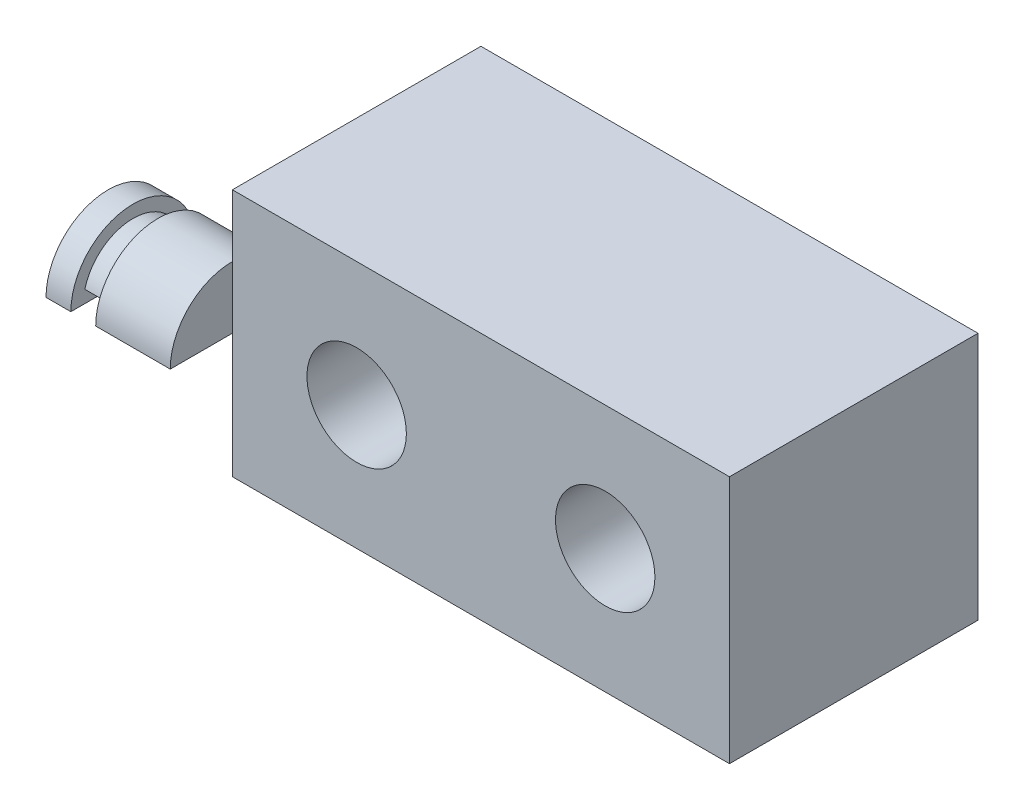
ISO-10303-21;
HEADER;
FILE_DESCRIPTION(('STEP AP214'),'2;1');
FILE_NAME('part.step','',(''),(''),'','','');
FILE_SCHEMA(('AUTOMOTIVE_DESIGN { 1 0 10303 214 1 1 1 1 }'));
ENDSEC;
DATA;
#1=APPLICATION_CONTEXT('core data for automotive mechanical design processes');
#2=APPLICATION_PROTOCOL_DEFINITION('international standard','automotive_design',2000,#1);
#3=PRODUCT_CONTEXT('',#1,'mechanical');
#4=PRODUCT('Part','Part','',(#3));
#5=PRODUCT_RELATED_PRODUCT_CATEGORY('part','',(#4));
#6=PRODUCT_DEFINITION_FORMATION('','',#4);
#7=PRODUCT_DEFINITION_CONTEXT('part definition',#1,'design');
#8=PRODUCT_DEFINITION('design','',#6,#7);
#9=PRODUCT_DEFINITION_SHAPE('','',#8);
#10=(LENGTH_UNIT() NAMED_UNIT(*) SI_UNIT(.MILLI.,.METRE.));
#11=(NAMED_UNIT(*) PLANE_ANGLE_UNIT() SI_UNIT($,.RADIAN.));
#12=(NAMED_UNIT(*) SI_UNIT($,.STERADIAN.) SOLID_ANGLE_UNIT());
#13=UNCERTAINTY_MEASURE_WITH_UNIT(LENGTH_MEASURE(1.E-05),#10,'distance_accuracy_value','');
#14=(GEOMETRIC_REPRESENTATION_CONTEXT(3) GLOBAL_UNCERTAINTY_ASSIGNED_CONTEXT((#13)) GLOBAL_UNIT_ASSIGNED_CONTEXT((#10,
#11,#12)) REPRESENTATION_CONTEXT('',''));
#15=CARTESIAN_POINT('',(0.,0.,0.));
#16=DIRECTION('',(0.,0.,1.));
#17=DIRECTION('',(1.,0.,0.));
#18=AXIS2_PLACEMENT_3D('',#15,#16,#17);
#19=CARTESIAN_POINT('',(-12.7,-12.7,0.));
#20=DIRECTION('',(1.,0.,0.));
#21=DIRECTION('',(0.,0.,-1.));
#22=AXIS2_PLACEMENT_3D('',#19,#20,#21);
#23=CYLINDRICAL_SURFACE('',#22,6.35);
#24=CARTESIAN_POINT('',(-7.62,-12.7,0.));
#25=DIRECTION('',(1.,0.,0.));
#26=DIRECTION('',(0.,0.,1.));
#27=AXIS2_PLACEMENT_3D('',#24,#25,#26);
#28=CIRCLE('',#27,6.35);
#29=CARTESIAN_POINT('',(-7.62,-12.7,-6.35));
#30=VERTEX_POINT('',#29);
#31=CARTESIAN_POINT('',(-7.62,-12.7,6.35));
#32=VERTEX_POINT('',#31);
#33=EDGE_CURVE('E57',#30,#32,#28,.T.);
#34=ORIENTED_EDGE('',*,*,#33,.T.);
#35=DIRECTION('',(1.,0.,0.));
#36=VECTOR('',#35,1.);
#37=CARTESIAN_POINT('',(-12.7,-12.7,6.35));
#38=LINE('',#37,#36);
#39=CARTESIAN_POINT('',(0.,-12.7,6.35));
#40=VERTEX_POINT('',#39);
#41=EDGE_CURVE('E173',#32,#40,#38,.T.);
#42=ORIENTED_EDGE('',*,*,#41,.T.);
#43=CARTESIAN_POINT('',(0.,-12.7,0.));
#44=DIRECTION('',(-1.,0.,0.));
#45=DIRECTION('',(0.,0.,1.));
#46=AXIS2_PLACEMENT_3D('',#43,#44,#45);
#47=CIRCLE('',#46,6.35);
#48=CARTESIAN_POINT('',(0.,-6.35,0.));
#49=VERTEX_POINT('',#48);
#50=EDGE_CURVE('E51',#40,#49,#47,.T.);
#51=ORIENTED_EDGE('',*,*,#50,.T.);
#52=CARTESIAN_POINT('',(0.,-12.7,-6.35));
#53=VERTEX_POINT('',#52);
#54=EDGE_CURVE('E11',#49,#53,#47,.T.);
#55=ORIENTED_EDGE('',*,*,#54,.T.);
#56=DIRECTION('',(1.,0.,0.));
#57=VECTOR('',#56,1.);
#58=CARTESIAN_POINT('',(-12.7,-12.7,-6.35));
#59=LINE('',#58,#57);
#60=EDGE_CURVE('E184',#30,#53,#59,.T.);
#61=ORIENTED_EDGE('',*,*,#60,.F.);
#62=EDGE_LOOP('',(#34,#42,#51,#55,#61));
#63=FACE_BOUND('',#62,.T.);
#64=ADVANCED_FACE('F39',(#63),#23,.T.);
#65=CARTESIAN_POINT('',(-12.7,-12.7,0.));
#66=DIRECTION('',(0.,-1.,0.));
#67=DIRECTION('',(0.,0.,-1.));
#68=AXIS2_PLACEMENT_3D('',#65,#66,#67);
#69=PLANE('',#68);
#70=ORIENTED_EDGE('',*,*,#41,.F.);
#71=DIRECTION('',(0.,0.,-1.));
#72=VECTOR('',#71,1.);
#73=CARTESIAN_POINT('',(-7.62,-12.7,6.35));
#74=LINE('',#73,#72);
#75=EDGE_CURVE('E159',#32,#30,#74,.T.);
#76=ORIENTED_EDGE('',*,*,#75,.T.);
#77=ORIENTED_EDGE('',*,*,#60,.T.);
#78=DIRECTION('',(0.,0.,-1.));
#79=VECTOR('',#78,1.);
#80=CARTESIAN_POINT('',(0.,-12.7,0.));
#81=LINE('',#80,#79);
#82=CARTESIAN_POINT('',(0.,-12.7,0.));
#83=VERTEX_POINT('',#82);
#84=EDGE_CURVE('E49',#83,#53,#81,.T.);
#85=ORIENTED_EDGE('',*,*,#84,.F.);
#86=EDGE_CURVE('E170',#40,#83,#81,.T.);
#87=ORIENTED_EDGE('',*,*,#86,.F.);
#88=EDGE_LOOP('',(#70,#76,#77,#85,#87));
#89=FACE_BOUND('',#88,.T.);
#90=ADVANCED_FACE('F281',(#89),#69,.T.);
#91=CARTESIAN_POINT('',(0.,-25.4,0.));
#92=DIRECTION('',(-1.,0.,0.));
#93=DIRECTION('',(0.,0.,1.));
#94=AXIS2_PLACEMENT_3D('',#91,#92,#93);
#95=PLANE('',#94);
#96=ORIENTED_EDGE('',*,*,#54,.F.);
#97=DIRECTION('',(0.,1.,0.));
#98=VECTOR('',#97,1.);
#99=CARTESIAN_POINT('',(0.,-25.4,0.));
#100=LINE('',#99,#98);
#101=CARTESIAN_POINT('',(0.,0.,0.));
#102=VERTEX_POINT('',#101);
#103=EDGE_CURVE('E223',#49,#102,#100,.T.);
#104=ORIENTED_EDGE('',*,*,#103,.T.);
#105=DIRECTION('',(0.,0.,1.));
#106=VECTOR('',#105,1.);
#107=CARTESIAN_POINT('',(0.,0.,0.));
#108=LINE('',#107,#106);
#109=CARTESIAN_POINT('',(0.,0.,-25.4));
#110=VERTEX_POINT('',#109);
#111=EDGE_CURVE('E194',#110,#102,#108,.T.);
#112=ORIENTED_EDGE('',*,*,#111,.F.);
#113=DIRECTION('',(0.,1.,0.));
#114=VECTOR('',#113,1.);
#115=CARTESIAN_POINT('',(0.,-25.4,-25.4));
#116=LINE('',#115,#114);
#117=CARTESIAN_POINT('',(0.,-25.4,-25.4));
#118=VERTEX_POINT('',#117);
#119=EDGE_CURVE('E238',#118,#110,#116,.T.);
#120=ORIENTED_EDGE('',*,*,#119,.F.);
#121=DIRECTION('',(0.,0.,1.));
#122=VECTOR('',#121,1.);
#123=CARTESIAN_POINT('',(0.,-25.4,0.));
#124=LINE('',#123,#122);
#125=CARTESIAN_POINT('',(0.,-25.4,0.));
#126=VERTEX_POINT('',#125);
#127=EDGE_CURVE('E206',#118,#126,#124,.T.);
#128=ORIENTED_EDGE('',*,*,#127,.T.);
#129=EDGE_CURVE('E43',#126,#83,#100,.T.);
#130=ORIENTED_EDGE('',*,*,#129,.T.);
#131=ORIENTED_EDGE('',*,*,#84,.T.);
#132=EDGE_LOOP('',(#96,#104,#112,#120,#128,#130,#131));
#133=FACE_BOUND('',#132,.T.);
#134=ADVANCED_FACE('F41',(#133),#95,.T.);
#135=CARTESIAN_POINT('',(0.,-25.4,-25.4));
#136=DIRECTION('',(0.,0.,-1.));
#137=DIRECTION('',(-1.,0.,0.));
#138=AXIS2_PLACEMENT_3D('',#135,#136,#137);
#139=PLANE('',#138);
#140=DIRECTION('',(-1.,0.,0.));
#141=VECTOR('',#140,1.);
#142=CARTESIAN_POINT('',(0.,0.,-25.4));
#143=LINE('',#142,#141);
#144=CARTESIAN_POINT('',(50.8,0.,-25.4));
#145=VERTEX_POINT('',#144);
#146=EDGE_CURVE('E211',#145,#110,#143,.T.);
#147=ORIENTED_EDGE('',*,*,#146,.F.);
#148=DIRECTION('',(0.,1.,0.));
#149=VECTOR('',#148,1.);
#150=CARTESIAN_POINT('',(50.8,-25.4,-25.4));
#151=LINE('',#150,#149);
#152=CARTESIAN_POINT('',(50.8,-25.4,-25.4));
#153=VERTEX_POINT('',#152);
#154=EDGE_CURVE('E241',#153,#145,#151,.T.);
#155=ORIENTED_EDGE('',*,*,#154,.F.);
#156=DIRECTION('',(-1.,0.,0.));
#157=VECTOR('',#156,1.);
#158=CARTESIAN_POINT('',(0.,-25.4,-25.4));
#159=LINE('',#158,#157);
#160=EDGE_CURVE('E219',#153,#118,#159,.T.);
#161=ORIENTED_EDGE('',*,*,#160,.T.);
#162=ORIENTED_EDGE('',*,*,#119,.T.);
#163=EDGE_LOOP('',(#147,#155,#161,#162));
#164=FACE_BOUND('',#163,.T.);
#165=ADVANCED_FACE('F264',(#164),#139,.T.);
#166=CARTESIAN_POINT('',(50.8,-25.4,0.));
#167=DIRECTION('',(1.,0.,0.));
#168=DIRECTION('',(0.,0.,-1.));
#169=AXIS2_PLACEMENT_3D('',#166,#167,#168);
#170=PLANE('',#169);
#171=DIRECTION('',(0.,0.,-1.));
#172=VECTOR('',#171,1.);
#173=CARTESIAN_POINT('',(50.8,0.,0.));
#174=LINE('',#173,#172);
#175=CARTESIAN_POINT('',(50.8,0.,0.));
#176=VERTEX_POINT('',#175);
#177=EDGE_CURVE('E231',#176,#145,#174,.T.);
#178=ORIENTED_EDGE('',*,*,#177,.F.);
#179=DIRECTION('',(0.,1.,0.));
#180=VECTOR('',#179,1.);
#181=CARTESIAN_POINT('',(50.8,-25.4,0.));
#182=LINE('',#181,#180);
#183=CARTESIAN_POINT('',(50.8,-25.4,0.));
#184=VERTEX_POINT('',#183);
#185=EDGE_CURVE('E243',#184,#176,#182,.T.);
#186=ORIENTED_EDGE('',*,*,#185,.F.);
#187=DIRECTION('',(0.,0.,-1.));
#188=VECTOR('',#187,1.);
#189=CARTESIAN_POINT('',(50.8,-25.4,0.));
#190=LINE('',#189,#188);
#191=EDGE_CURVE('E215',#184,#153,#190,.T.);
#192=ORIENTED_EDGE('',*,*,#191,.T.);
#193=ORIENTED_EDGE('',*,*,#154,.T.);
#194=EDGE_LOOP('',(#178,#186,#192,#193));
#195=FACE_BOUND('',#194,.T.);
#196=ADVANCED_FACE('F346',(#195),#170,.T.);
#197=CARTESIAN_POINT('',(0.,-25.4,0.));
#198=DIRECTION('',(0.,0.,1.));
#199=DIRECTION('',(1.,0.,0.));
#200=AXIS2_PLACEMENT_3D('',#197,#198,#199);
#201=PLANE('',#200);
#202=CARTESIAN_POINT('',(12.7,-12.7,0.));
#203=DIRECTION('',(0.,0.,1.));
#204=DIRECTION('',(1.,0.,0.));
#205=AXIS2_PLACEMENT_3D('',#202,#203,#204);
#206=CIRCLE('',#205,5.08);
#207=CARTESIAN_POINT('',(17.78,-12.7,0.));
#208=VERTEX_POINT('',#207);
#209=EDGE_CURVE('E195',#208,#208,#206,.T.);
#210=ORIENTED_EDGE('',*,*,#209,.F.);
#211=EDGE_LOOP('',(#210));
#212=FACE_BOUND('',#211,.T.);
#213=CARTESIAN_POINT('',(38.1,-12.7,0.));
#214=DIRECTION('',(0.,0.,1.));
#215=DIRECTION('',(1.,0.,0.));
#216=AXIS2_PLACEMENT_3D('',#213,#214,#215);
#217=CIRCLE('',#216,5.08000000000001);
#218=CARTESIAN_POINT('',(43.18,-12.7,0.));
#219=VERTEX_POINT('',#218);
#220=EDGE_CURVE('E189',#219,#219,#217,.T.);
#221=ORIENTED_EDGE('',*,*,#220,.F.);
#222=EDGE_LOOP('',(#221));
#223=FACE_BOUND('',#222,.T.);
#224=DIRECTION('',(1.,0.,0.));
#225=VECTOR('',#224,1.);
#226=CARTESIAN_POINT('',(0.,0.,0.));
#227=LINE('',#226,#225);
#228=EDGE_CURVE('E227',#102,#176,#227,.T.);
#229=ORIENTED_EDGE('',*,*,#228,.F.);
#230=ORIENTED_EDGE('',*,*,#103,.F.);
#231=EDGE_CURVE('E250',#83,#49,#100,.T.);
#232=ORIENTED_EDGE('',*,*,#231,.F.);
#233=ORIENTED_EDGE('',*,*,#129,.F.);
#234=DIRECTION('',(1.,0.,0.));
#235=VECTOR('',#234,1.);
#236=CARTESIAN_POINT('',(0.,-25.4,0.));
#237=LINE('',#236,#235);
#238=EDGE_CURVE('E210',#126,#184,#237,.T.);
#239=ORIENTED_EDGE('',*,*,#238,.T.);
#240=ORIENTED_EDGE('',*,*,#185,.T.);
#241=EDGE_LOOP('',(#229,#230,#232,#233,#239,#240));
#242=FACE_BOUND('',#241,.T.);
#243=ADVANCED_FACE('F259',(#212,#223,#242),#201,.T.);
#244=CARTESIAN_POINT('',(0.,-25.4,0.));
#245=DIRECTION('',(0.,-1.,0.));
#246=DIRECTION('',(0.,0.,-1.));
#247=AXIS2_PLACEMENT_3D('',#244,#245,#246);
#248=PLANE('',#247);
#249=ORIENTED_EDGE('',*,*,#127,.F.);
#250=ORIENTED_EDGE('',*,*,#160,.F.);
#251=ORIENTED_EDGE('',*,*,#191,.F.);
#252=ORIENTED_EDGE('',*,*,#238,.F.);
#253=EDGE_LOOP('',(#249,#250,#251,#252));
#254=FACE_BOUND('',#253,.T.);
#255=ADVANCED_FACE('F269',(#254),#248,.T.);
#256=CARTESIAN_POINT('',(0.,0.,0.));
#257=DIRECTION('',(0.,-1.,0.));
#258=DIRECTION('',(0.,0.,-1.));
#259=AXIS2_PLACEMENT_3D('',#256,#257,#258);
#260=PLANE('',#259);
#261=ORIENTED_EDGE('',*,*,#111,.T.);
#262=ORIENTED_EDGE('',*,*,#228,.T.);
#263=ORIENTED_EDGE('',*,*,#177,.T.);
#264=ORIENTED_EDGE('',*,*,#146,.T.);
#265=EDGE_LOOP('',(#261,#262,#263,#264));
#266=FACE_BOUND('',#265,.T.);
#267=ADVANCED_FACE('F261',(#266),#260,.F.);
#268=CARTESIAN_POINT('',(38.1,-12.7,-13.97));
#269=DIRECTION('',(0.,0.,1.));
#270=DIRECTION('',(1.,0.,0.));
#271=AXIS2_PLACEMENT_3D('',#268,#269,#270);
#272=CYLINDRICAL_SURFACE('',#271,5.08000000000001);
#273=CARTESIAN_POINT('',(38.1,-12.7,-13.97));
#274=DIRECTION('',(0.,0.,1.));
#275=DIRECTION('',(1.,0.,0.));
#276=AXIS2_PLACEMENT_3D('',#273,#274,#275);
#277=CIRCLE('',#276,5.08000000000001);
#278=CARTESIAN_POINT('',(43.18,-12.7,-13.97));
#279=VERTEX_POINT('',#278);
#280=EDGE_CURVE('E199',#279,#279,#277,.T.);
#281=ORIENTED_EDGE('',*,*,#280,.F.);
#282=EDGE_LOOP('',(#281));
#283=FACE_BOUND('',#282,.T.);
#284=ORIENTED_EDGE('',*,*,#220,.T.);
#285=EDGE_LOOP('',(#284));
#286=FACE_BOUND('',#285,.T.);
#287=ADVANCED_FACE('F335',(#283,#286),#272,.F.);
#288=CARTESIAN_POINT('',(38.1,-12.7,-13.97));
#289=DIRECTION('',(0.,0.,1.));
#290=DIRECTION('',(1.,0.,0.));
#291=AXIS2_PLACEMENT_3D('',#288,#289,#290);
#292=PLANE('',#291);
#293=ORIENTED_EDGE('',*,*,#280,.T.);
#294=EDGE_LOOP('',(#293));
#295=FACE_BOUND('',#294,.T.);
#296=ADVANCED_FACE('F329',(#295),#292,.T.);
#297=CARTESIAN_POINT('',(12.7,-12.7,-13.97));
#298=DIRECTION('',(0.,0.,1.));
#299=DIRECTION('',(1.,0.,0.));
#300=AXIS2_PLACEMENT_3D('',#297,#298,#299);
#301=CYLINDRICAL_SURFACE('',#300,5.08);
#302=CARTESIAN_POINT('',(12.7,-12.7,-13.97));
#303=DIRECTION('',(0.,0.,1.));
#304=DIRECTION('',(1.,0.,0.));
#305=AXIS2_PLACEMENT_3D('',#302,#303,#304);
#306=CIRCLE('',#305,5.08);
#307=CARTESIAN_POINT('',(17.78,-12.7,-13.97));
#308=VERTEX_POINT('',#307);
#309=EDGE_CURVE('E190',#308,#308,#306,.T.);
#310=ORIENTED_EDGE('',*,*,#309,.F.);
#311=EDGE_LOOP('',(#310));
#312=FACE_BOUND('',#311,.T.);
#313=ORIENTED_EDGE('',*,*,#209,.T.);
#314=EDGE_LOOP('',(#313));
#315=FACE_BOUND('',#314,.T.);
#316=ADVANCED_FACE('F324',(#312,#315),#301,.F.);
#317=CARTESIAN_POINT('',(12.7,-12.7,-13.97));
#318=DIRECTION('',(0.,0.,1.));
#319=DIRECTION('',(1.,0.,0.));
#320=AXIS2_PLACEMENT_3D('',#317,#318,#319);
#321=PLANE('',#320);
#322=ORIENTED_EDGE('',*,*,#309,.T.);
#323=EDGE_LOOP('',(#322));
#324=FACE_BOUND('',#323,.T.);
#325=ADVANCED_FACE('F320',(#324),#321,.T.);
#326=CARTESIAN_POINT('',(0.,-12.7,0.));
#327=DIRECTION('',(-1.,0.,0.));
#328=DIRECTION('',(0.,0.,1.));
#329=AXIS2_PLACEMENT_3D('',#326,#327,#328);
#330=PLANE('',#329);
#331=ORIENTED_EDGE('',*,*,#86,.T.);
#332=ORIENTED_EDGE('',*,*,#231,.T.);
#333=ORIENTED_EDGE('',*,*,#50,.F.);
#334=EDGE_LOOP('',(#331,#332,#333));
#335=FACE_BOUND('',#334,.T.);
#336=ADVANCED_FACE('F273',(#335),#330,.F.);
#337=CARTESIAN_POINT('',(-10.16,-12.7,0.));
#338=DIRECTION('',(-1.,0.,0.));
#339=DIRECTION('',(0.,0.,1.));
#340=AXIS2_PLACEMENT_3D('',#337,#338,#339);
#341=PLANE('',#340);
#342=CARTESIAN_POINT('',(-10.16,-12.7,0.));
#343=DIRECTION('',(1.,0.,0.));
#344=DIRECTION('',(0.,0.,1.));
#345=AXIS2_PLACEMENT_3D('',#342,#343,#344);
#346=CIRCLE('',#345,5.08);
#347=CARTESIAN_POINT('',(-10.16,-11.43,-4.91868884968342));
#348=VERTEX_POINT('',#347);
#349=CARTESIAN_POINT('',(-10.16,-11.43,4.91868884968342));
#350=VERTEX_POINT('',#349);
#351=EDGE_CURVE('E141',#348,#350,#346,.T.);
#352=ORIENTED_EDGE('',*,*,#351,.F.);
#353=DIRECTION('',(0.,0.,-1.));
#354=VECTOR('',#353,1.);
#355=CARTESIAN_POINT('',(-10.16,-11.43,4.91868884968342));
#356=LINE('',#355,#354);
#357=EDGE_CURVE('E130',#350,#348,#356,.T.);
#358=ORIENTED_EDGE('',*,*,#357,.F.);
#359=EDGE_LOOP('',(#352,#358));
#360=FACE_BOUND('',#359,.T.);
#361=CARTESIAN_POINT('',(-10.16,-12.7,0.));
#362=DIRECTION('',(1.,0.,0.));
#363=DIRECTION('',(0.,0.,1.));
#364=AXIS2_PLACEMENT_3D('',#361,#362,#363);
#365=CIRCLE('',#364,6.35);
#366=CARTESIAN_POINT('',(-10.16,-12.7,-6.35));
#367=VERTEX_POINT('',#366);
#368=CARTESIAN_POINT('',(-10.16,-12.7,6.35));
#369=VERTEX_POINT('',#368);
#370=EDGE_CURVE('E64',#367,#369,#365,.T.);
#371=ORIENTED_EDGE('',*,*,#370,.T.);
#372=DIRECTION('',(0.,0.,-1.));
#373=VECTOR('',#372,1.);
#374=CARTESIAN_POINT('',(-10.16,-12.7,6.35));
#375=LINE('',#374,#373);
#376=EDGE_CURVE('E158',#369,#367,#375,.T.);
#377=ORIENTED_EDGE('',*,*,#376,.T.);
#378=EDGE_LOOP('',(#371,#377));
#379=FACE_BOUND('',#378,.T.);
#380=ADVANCED_FACE('F140',(#360,#379),#341,.F.);
#381=CARTESIAN_POINT('',(-7.62,-12.7,0.));
#382=DIRECTION('',(-1.,0.,0.));
#383=DIRECTION('',(0.,0.,1.));
#384=AXIS2_PLACEMENT_3D('',#381,#382,#383);
#385=PLANE('',#384);
#386=DIRECTION('',(0.,0.,-1.));
#387=VECTOR('',#386,1.);
#388=CARTESIAN_POINT('',(-7.62,-11.43,4.91868884968342));
#389=LINE('',#388,#387);
#390=CARTESIAN_POINT('',(-7.62,-11.43,4.91868884968342));
#391=VERTEX_POINT('',#390);
#392=CARTESIAN_POINT('',(-7.62,-11.43,-4.91868884968342));
#393=VERTEX_POINT('',#392);
#394=EDGE_CURVE('E132',#391,#393,#389,.T.);
#395=ORIENTED_EDGE('',*,*,#394,.T.);
#396=CARTESIAN_POINT('',(-7.62,-12.7,0.));
#397=DIRECTION('',(1.,0.,0.));
#398=DIRECTION('',(0.,0.,1.));
#399=AXIS2_PLACEMENT_3D('',#396,#397,#398);
#400=CIRCLE('',#399,5.08);
#401=EDGE_CURVE('E149',#393,#391,#400,.T.);
#402=ORIENTED_EDGE('',*,*,#401,.T.);
#403=EDGE_LOOP('',(#395,#402));
#404=FACE_BOUND('',#403,.T.);
#405=ORIENTED_EDGE('',*,*,#33,.F.);
#406=ORIENTED_EDGE('',*,*,#75,.F.);
#407=EDGE_LOOP('',(#405,#406));
#408=FACE_BOUND('',#407,.T.);
#409=ADVANCED_FACE('F282',(#404,#408),#385,.T.);
#410=CARTESIAN_POINT('',(-10.16,-12.7,0.));
#411=DIRECTION('',(1.,0.,0.));
#412=DIRECTION('',(0.,0.,-1.));
#413=AXIS2_PLACEMENT_3D('',#410,#411,#412);
#414=CYLINDRICAL_SURFACE('',#413,5.08);
#415=ORIENTED_EDGE('',*,*,#401,.F.);
#416=DIRECTION('',(1.,0.,0.));
#417=VECTOR('',#416,1.);
#418=CARTESIAN_POINT('',(-10.16,-11.43,-4.91868884968342));
#419=LINE('',#418,#417);
#420=EDGE_CURVE('E137',#348,#393,#419,.T.);
#421=ORIENTED_EDGE('',*,*,#420,.F.);
#422=ORIENTED_EDGE('',*,*,#351,.T.);
#423=DIRECTION('',(1.,0.,0.));
#424=VECTOR('',#423,1.);
#425=CARTESIAN_POINT('',(-10.16,-11.43,4.91868884968342));
#426=LINE('',#425,#424);
#427=EDGE_CURVE('E127',#350,#391,#426,.T.);
#428=ORIENTED_EDGE('',*,*,#427,.T.);
#429=EDGE_LOOP('',(#415,#421,#422,#428));
#430=FACE_BOUND('',#429,.T.);
#431=ADVANCED_FACE('F145',(#430),#414,.T.);
#432=CARTESIAN_POINT('',(-10.16,-11.43,4.91868884968342));
#433=DIRECTION('',(0.,-1.,0.));
#434=DIRECTION('',(0.,0.,-1.));
#435=AXIS2_PLACEMENT_3D('',#432,#433,#434);
#436=PLANE('',#435);
#437=ORIENTED_EDGE('',*,*,#394,.F.);
#438=ORIENTED_EDGE('',*,*,#427,.F.);
#439=ORIENTED_EDGE('',*,*,#357,.T.);
#440=ORIENTED_EDGE('',*,*,#420,.T.);
#441=EDGE_LOOP('',(#437,#438,#439,#440));
#442=FACE_BOUND('',#441,.T.);
#443=ADVANCED_FACE('F129',(#442),#436,.T.);
#444=CARTESIAN_POINT('',(-12.7,-12.7,0.));
#445=DIRECTION('',(-1.,0.,0.));
#446=DIRECTION('',(0.,0.,1.));
#447=AXIS2_PLACEMENT_3D('',#444,#445,#446);
#448=PLANE('',#447);
#449=CARTESIAN_POINT('',(-12.7,-12.7,0.));
#450=DIRECTION('',(-1.,0.,0.));
#451=DIRECTION('',(0.,0.,1.));
#452=AXIS2_PLACEMENT_3D('',#449,#450,#451);
#453=CIRCLE('',#452,6.35);
#454=CARTESIAN_POINT('',(-12.7,-12.7,6.35));
#455=VERTEX_POINT('',#454);
#456=CARTESIAN_POINT('',(-12.7,-12.7,-6.35));
#457=VERTEX_POINT('',#456);
#458=EDGE_CURVE('E166',#455,#457,#453,.T.);
#459=ORIENTED_EDGE('',*,*,#458,.T.);
#460=DIRECTION('',(0.,0.,-1.));
#461=VECTOR('',#460,1.);
#462=CARTESIAN_POINT('',(-12.7,-12.7,0.));
#463=LINE('',#462,#461);
#464=EDGE_CURVE('E169',#455,#457,#463,.T.);
#465=ORIENTED_EDGE('',*,*,#464,.F.);
#466=EDGE_LOOP('',(#459,#465));
#467=FACE_BOUND('',#466,.T.);
#468=ADVANCED_FACE('F307',(#467),#448,.T.);
#469=ORIENTED_EDGE('',*,*,#376,.F.);
#470=EDGE_CURVE('E180',#455,#369,#38,.T.);
#471=ORIENTED_EDGE('',*,*,#470,.F.);
#472=ORIENTED_EDGE('',*,*,#464,.T.);
#473=EDGE_CURVE('E185',#457,#367,#59,.T.);
#474=ORIENTED_EDGE('',*,*,#473,.T.);
#475=EDGE_LOOP('',(#469,#471,#472,#474));
#476=FACE_BOUND('',#475,.T.);
#477=ADVANCED_FACE('F300',(#476),#69,.T.);
#478=ORIENTED_EDGE('',*,*,#470,.T.);
#479=ORIENTED_EDGE('',*,*,#370,.F.);
#480=ORIENTED_EDGE('',*,*,#473,.F.);
#481=ORIENTED_EDGE('',*,*,#458,.F.);
#482=EDGE_LOOP('',(#478,#479,#480,#481));
#483=FACE_BOUND('',#482,.T.);
#484=ADVANCED_FACE('F295',(#483),#23,.T.);
#485=CLOSED_SHELL('',(#64,#90,#134,#165,#196,#243,#255,#267,#287,#296,#316,#325,#336,#380,#409,
#431,#443,#468,#477,#484));
#486=MANIFOLD_SOLID_BREP('B2',#485);
#487=ADVANCED_BREP_SHAPE_REPRESENTATION('',(#18,#486),#14);
#488=SHAPE_DEFINITION_REPRESENTATION(#9,#487);
ENDSEC;
END-ISO-10303-21;
